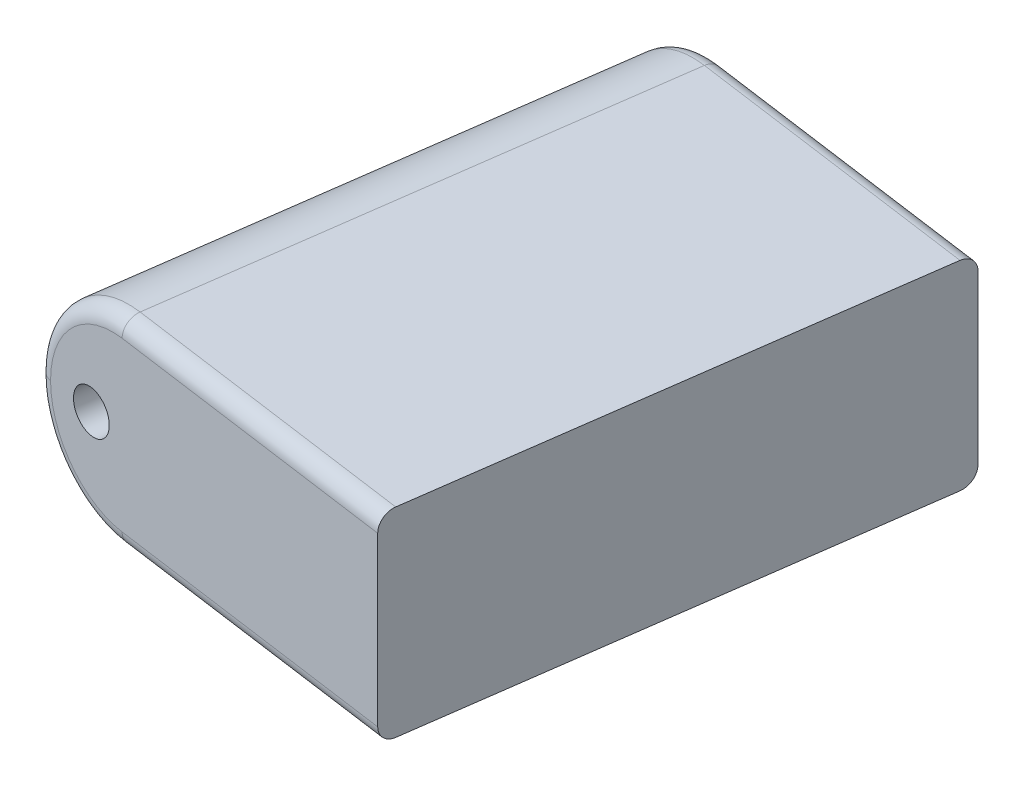
ISO-10303-21;
HEADER;
FILE_DESCRIPTION(('STEP AP214'),'2;1');
FILE_NAME('part.step','',(''),(''),'','','');
FILE_SCHEMA(('AUTOMOTIVE_DESIGN { 1 0 10303 214 1 1 1 1 }'));
ENDSEC;
DATA;
#1=APPLICATION_CONTEXT('core data for automotive mechanical design processes');
#2=APPLICATION_PROTOCOL_DEFINITION('international standard','automotive_design',2000,#1);
#3=PRODUCT_CONTEXT('',#1,'mechanical');
#4=PRODUCT('Part','Part','',(#3));
#5=PRODUCT_RELATED_PRODUCT_CATEGORY('part','',(#4));
#6=PRODUCT_DEFINITION_FORMATION('','',#4);
#7=PRODUCT_DEFINITION_CONTEXT('part definition',#1,'design');
#8=PRODUCT_DEFINITION('design','',#6,#7);
#9=PRODUCT_DEFINITION_SHAPE('','',#8);
#10=(LENGTH_UNIT() NAMED_UNIT(*) SI_UNIT(.MILLI.,.METRE.));
#11=(NAMED_UNIT(*) PLANE_ANGLE_UNIT() SI_UNIT($,.RADIAN.));
#12=(NAMED_UNIT(*) SI_UNIT($,.STERADIAN.) SOLID_ANGLE_UNIT());
#13=UNCERTAINTY_MEASURE_WITH_UNIT(LENGTH_MEASURE(1.E-05),#10,'distance_accuracy_value','');
#14=(GEOMETRIC_REPRESENTATION_CONTEXT(3) GLOBAL_UNCERTAINTY_ASSIGNED_CONTEXT((#13)) GLOBAL_UNIT_ASSIGNED_CONTEXT((#10,
#11,#12)) REPRESENTATION_CONTEXT('',''));
#15=CARTESIAN_POINT('',(0.,0.,0.));
#16=DIRECTION('',(0.,0.,1.));
#17=DIRECTION('',(1.,0.,0.));
#18=AXIS2_PLACEMENT_3D('',#15,#16,#17);
#19=CARTESIAN_POINT('',(-23.9416188893365,9.525,-6.04046528507022));
#20=DIRECTION('',(-0.990563834972414,0.,-0.137052139146913));
#21=DIRECTION('',(-0.137052139146913,0.,0.990563834972414));
#22=AXIS2_PLACEMENT_3D('',#19,#20,#21);
#23=PLANE('',#22);
#24=DIRECTION('',(0.137052139146913,0.,-0.990563834972414));
#25=VECTOR('',#24,1.);
#26=CARTESIAN_POINT('',(-23.9416188893365,0.,-6.04046528507022));
#27=LINE('',#26,#25);
#28=CARTESIAN_POINT('',(-27.3183094936381,0.,18.3650464809801));
#29=VERTEX_POINT('',#28);
#30=CARTESIAN_POINT('',(-24.0460526193664,0.,-5.28565564282124));
#31=VERTEX_POINT('',#30);
#32=EDGE_CURVE('E229',#29,#31,#27,.T.);
#33=ORIENTED_EDGE('',*,*,#32,.T.);
#34=CARTESIAN_POINT('',(-24.0460526193664,0.762000000000001,-5.28565564282124));
#35=DIRECTION('',(-0.990563834972414,0.,-0.137052139146913));
#36=DIRECTION('',(-0.137052139146913,0.,0.990563834972414));
#37=AXIS2_PLACEMENT_3D('',#34,#35,#36);
#38=CIRCLE('',#37,0.762);
#39=CARTESIAN_POINT('',(-23.9416188893365,0.762000000000004,-6.04046528507022));
#40=VERTEX_POINT('',#39);
#41=EDGE_CURVE('E148',#31,#40,#38,.F.);
#42=ORIENTED_EDGE('',*,*,#41,.T.);
#43=DIRECTION('',(0.,-1.,0.));
#44=VECTOR('',#43,1.);
#45=CARTESIAN_POINT('',(-23.9416188893365,9.525,-6.04046528507022));
#46=LINE('',#45,#44);
#47=CARTESIAN_POINT('',(-23.9416188893365,8.763,-6.04046528507022));
#48=VERTEX_POINT('',#47);
#49=EDGE_CURVE('E130',#48,#40,#46,.T.);
#50=ORIENTED_EDGE('',*,*,#49,.F.);
#51=CARTESIAN_POINT('',(-24.0460526193664,8.763,-5.28565564282124));
#52=DIRECTION('',(-0.990563834972414,0.,-0.137052139146913));
#53=DIRECTION('',(-0.137052139146913,0.,0.990563834972414));
#54=AXIS2_PLACEMENT_3D('',#51,#52,#53);
#55=CIRCLE('',#54,0.762);
#56=CARTESIAN_POINT('',(-24.0460526193664,9.525,-5.28565564282124));
#57=VERTEX_POINT('',#56);
#58=EDGE_CURVE('E145',#48,#57,#55,.F.);
#59=ORIENTED_EDGE('',*,*,#58,.T.);
#60=DIRECTION('',(0.137052139146913,0.,-0.990563834972414));
#61=VECTOR('',#60,1.);
#62=CARTESIAN_POINT('',(-23.9416188893365,9.525,-6.04046528507022));
#63=LINE('',#62,#61);
#64=CARTESIAN_POINT('',(-27.3183094936381,9.525,18.3650464809801));
#65=VERTEX_POINT('',#64);
#66=EDGE_CURVE('E225',#65,#57,#63,.T.);
#67=ORIENTED_EDGE('',*,*,#66,.F.);
#68=CARTESIAN_POINT('',(-27.3183094936381,8.763,18.3650464809801));
#69=DIRECTION('',(-0.990563834972414,0.,-0.137052139146913));
#70=DIRECTION('',(-0.137052139146913,0.,0.990563834972414));
#71=AXIS2_PLACEMENT_3D('',#68,#69,#70);
#72=CIRCLE('',#71,0.762);
#73=CARTESIAN_POINT('',(-27.4227432236681,8.763,19.1198561232291));
#74=VERTEX_POINT('',#73);
#75=EDGE_CURVE('E163',#65,#74,#72,.F.);
#76=ORIENTED_EDGE('',*,*,#75,.T.);
#77=DIRECTION('',(0.,-1.,0.));
#78=VECTOR('',#77,1.);
#79=CARTESIAN_POINT('',(-27.4227432236681,9.525,19.1198561232291));
#80=LINE('',#79,#78);
#81=CARTESIAN_POINT('',(-27.4227432236681,0.762000000000004,19.1198561232291));
#82=VERTEX_POINT('',#81);
#83=EDGE_CURVE('E151',#74,#82,#80,.T.);
#84=ORIENTED_EDGE('',*,*,#83,.T.);
#85=CARTESIAN_POINT('',(-27.3183094936381,0.762000000000001,18.3650464809801));
#86=DIRECTION('',(-0.990563834972414,0.,-0.137052139146913));
#87=DIRECTION('',(-0.137052139146913,0.,0.990563834972414));
#88=AXIS2_PLACEMENT_3D('',#85,#86,#87);
#89=CIRCLE('',#88,0.762);
#90=EDGE_CURVE('E157',#82,#29,#89,.F.);
#91=ORIENTED_EDGE('',*,*,#90,.T.);
#92=EDGE_LOOP('',(#33,#42,#50,#59,#67,#76,#84,#91));
#93=FACE_BOUND('',#92,.T.);
#94=ADVANCED_FACE('F45',(#93),#23,.F.);
#95=CARTESIAN_POINT('',(-42.8118599455609,9.525,-8.65130853581891));
#96=DIRECTION('',(-0.137052139146913,0.,0.990563834972414));
#97=DIRECTION('',(0.990563834972414,0.,0.137052139146913));
#98=AXIS2_PLACEMENT_3D('',#95,#96,#97);
#99=PLANE('',#98);
#100=ORIENTED_EDGE('',*,*,#49,.T.);
#101=DIRECTION('',(-0.990563834972414,0.,-0.137052139146913));
#102=VECTOR('',#101,1.);
#103=CARTESIAN_POINT('',(-38.0942996815048,0.762000000000001,-7.99859772313174));
#104=LINE('',#103,#102);
#105=CARTESIAN_POINT('',(-38.0942996815048,0.762,-7.99859772313174));
#106=VERTEX_POINT('',#105);
#107=EDGE_CURVE('E139',#40,#106,#104,.T.);
#108=ORIENTED_EDGE('',*,*,#107,.T.);
#109=CARTESIAN_POINT('',(-38.0942996815048,4.7625,-7.99859772313174));
#110=DIRECTION('',(-0.137052139146913,0.,0.990563834972414));
#111=DIRECTION('',(0.990563834972414,0.,0.137052139146913));
#112=AXIS2_PLACEMENT_3D('',#109,#110,#111);
#113=CIRCLE('',#112,4.0005);
#114=CARTESIAN_POINT('',(-42.057050303312,4.7625,-8.54687480578897));
#115=VERTEX_POINT('',#114);
#116=EDGE_CURVE('E140',#106,#115,#113,.F.);
#117=ORIENTED_EDGE('',*,*,#116,.T.);
#118=CARTESIAN_POINT('',(-38.0942996815048,4.7625,-7.99859772313174));
#119=DIRECTION('',(-0.137052139146913,0.,0.990563834972414));
#120=DIRECTION('',(0.990563834972414,0.,0.137052139146913));
#121=AXIS2_PLACEMENT_3D('',#118,#119,#120);
#122=CIRCLE('',#121,4.0005);
#123=CARTESIAN_POINT('',(-38.0942996815048,8.763,-7.99859772313174));
#124=VERTEX_POINT('',#123);
#125=EDGE_CURVE('E133',#115,#124,#122,.F.);
#126=ORIENTED_EDGE('',*,*,#125,.T.);
#127=DIRECTION('',(-0.990563834972414,0.,-0.137052139146913));
#128=VECTOR('',#127,1.);
#129=CARTESIAN_POINT('',(-42.8118599455609,8.763,-8.65130853581891));
#130=LINE('',#129,#128);
#131=EDGE_CURVE('E125',#124,#48,#130,.F.);
#132=ORIENTED_EDGE('',*,*,#131,.T.);
#133=EDGE_LOOP('',(#100,#108,#117,#126,#132));
#134=FACE_BOUND('',#133,.T.);
#135=CARTESIAN_POINT('',(-39.7967519465306,4.7625,-8.23414511188111));
#136=DIRECTION('',(0.137052139146914,0.,-0.990563834972414));
#137=DIRECTION('',(-0.990563834972414,0.,-0.137052139146914));
#138=AXIS2_PLACEMENT_3D('',#135,#136,#137);
#139=CIRCLE('',#138,2.);
#140=CARTESIAN_POINT('',(-41.7778796164755,4.7625,-8.50824939017494));
#141=VERTEX_POINT('',#140);
#142=EDGE_CURVE('E237',#141,#141,#139,.T.);
#143=ORIENTED_EDGE('',*,*,#142,.F.);
#144=EDGE_LOOP('',(#143));
#145=FACE_BOUND('',#144,.T.);
#146=ADVANCED_FACE('F127',(#134,#145),#99,.F.);
#147=CARTESIAN_POINT('',(-27.4227432236681,9.525,19.1198561232291));
#148=DIRECTION('',(0.137052139146913,0.,-0.990563834972414));
#149=DIRECTION('',(-0.990563834972414,0.,-0.137052139146913));
#150=AXIS2_PLACEMENT_3D('',#147,#148,#149);
#151=PLANE('',#150);
#152=CARTESIAN_POINT('',(-43.2778762808622,4.7625,16.9261762964182));
#153=DIRECTION('',(0.137052139146913,0.,-0.990563834972414));
#154=DIRECTION('',(-0.990563834972414,0.,-0.137052139146913));
#155=AXIS2_PLACEMENT_3D('',#152,#153,#154);
#156=CIRCLE('',#155,1.);
#157=CARTESIAN_POINT('',(-44.2684401158347,4.7625,16.7891241572713));
#158=VERTEX_POINT('',#157);
#159=EDGE_CURVE('E240',#158,#158,#156,.T.);
#160=ORIENTED_EDGE('',*,*,#159,.T.);
#161=EDGE_LOOP('',(#160));
#162=FACE_BOUND('',#161,.T.);
#163=CARTESIAN_POINT('',(-41.5754240158364,4.7625,17.1617236851676));
#164=DIRECTION('',(0.137052139146913,0.,-0.990563834972414));
#165=DIRECTION('',(-0.990563834972414,0.,-0.137052139146913));
#166=AXIS2_PLACEMENT_3D('',#163,#164,#165);
#167=CIRCLE('',#166,4.0005);
#168=CARTESIAN_POINT('',(-45.5381746376436,4.7625,16.6134466025103));
#169=VERTEX_POINT('',#168);
#170=CARTESIAN_POINT('',(-41.5754240158364,0.762,17.1617236851676));
#171=VERTEX_POINT('',#170);
#172=EDGE_CURVE('E177',#169,#171,#167,.F.);
#173=ORIENTED_EDGE('',*,*,#172,.T.);
#174=DIRECTION('',(0.990563834972414,0.,0.137052139146913));
#175=VECTOR('',#174,1.);
#176=CARTESIAN_POINT('',(-27.4227432236681,0.762000000000001,19.1198561232291));
#177=LINE('',#176,#175);
#178=EDGE_CURVE('E180',#171,#82,#177,.T.);
#179=ORIENTED_EDGE('',*,*,#178,.T.);
#180=ORIENTED_EDGE('',*,*,#83,.F.);
#181=DIRECTION('',(0.990563834972414,0.,0.137052139146913));
#182=VECTOR('',#181,1.);
#183=CARTESIAN_POINT('',(-27.4227432236681,8.763,19.1198561232291));
#184=LINE('',#183,#182);
#185=CARTESIAN_POINT('',(-41.5754240158364,8.763,17.1617236851676));
#186=VERTEX_POINT('',#185);
#187=EDGE_CURVE('E171',#74,#186,#184,.F.);
#188=ORIENTED_EDGE('',*,*,#187,.T.);
#189=CARTESIAN_POINT('',(-41.5754240158364,4.7625,17.1617236851676));
#190=DIRECTION('',(0.137052139146913,0.,-0.990563834972414));
#191=DIRECTION('',(-0.990563834972414,0.,-0.137052139146913));
#192=AXIS2_PLACEMENT_3D('',#189,#190,#191);
#193=CIRCLE('',#192,4.0005);
#194=EDGE_CURVE('E174',#186,#169,#193,.F.);
#195=ORIENTED_EDGE('',*,*,#194,.T.);
#196=EDGE_LOOP('',(#173,#179,#180,#188,#195));
#197=FACE_BOUND('',#196,.T.);
#198=ADVANCED_FACE('F297',(#162,#197),#151,.F.);
#199=CARTESIAN_POINT('',(0.,9.525,0.));
#200=DIRECTION('',(0.,-1.,0.));
#201=DIRECTION('',(0.,0.,-1.));
#202=AXIS2_PLACEMENT_3D('',#199,#200,#201);
#203=PLANE('',#202);
#204=ORIENTED_EDGE('',*,*,#66,.T.);
#205=DIRECTION('',(-0.990563834972414,0.,-0.137052139146913));
#206=VECTOR('',#205,1.);
#207=CARTESIAN_POINT('',(0.265910804515712,9.525,-1.92190817247537));
#208=LINE('',#207,#206);
#209=CARTESIAN_POINT('',(-38.1987334115348,9.525,-7.24378808088276));
#210=VERTEX_POINT('',#209);
#211=EDGE_CURVE('E155',#57,#210,#208,.T.);
#212=ORIENTED_EDGE('',*,*,#211,.T.);
#213=DIRECTION('',(-0.137052139146913,0.,0.990563834972414));
#214=VECTOR('',#213,1.);
#215=CARTESIAN_POINT('',(-38.4646442160505,9.525,-5.3218799084074));
#216=LINE('',#215,#214);
#217=CARTESIAN_POINT('',(-41.4709902858065,9.525,16.4069140429186));
#218=VERTEX_POINT('',#217);
#219=EDGE_CURVE('E150',#210,#218,#216,.T.);
#220=ORIENTED_EDGE('',*,*,#219,.T.);
#221=DIRECTION('',(0.990563834972414,0.,0.137052139146913));
#222=VECTOR('',#221,1.);
#223=CARTESIAN_POINT('',(-3.00634606975599,9.525,21.728793951326));
#224=LINE('',#223,#222);
#225=EDGE_CURVE('E161',#218,#65,#224,.T.);
#226=ORIENTED_EDGE('',*,*,#225,.T.);
#227=EDGE_LOOP('',(#204,#212,#220,#226));
#228=FACE_BOUND('',#227,.T.);
#229=ADVANCED_FACE('F224',(#228),#203,.F.);
#230=CARTESIAN_POINT('',(0.,0.,0.));
#231=DIRECTION('',(0.,-1.,0.));
#232=DIRECTION('',(0.,0.,-1.));
#233=AXIS2_PLACEMENT_3D('',#230,#231,#232);
#234=PLANE('',#233);
#235=DIRECTION('',(-0.137052139146913,0.,0.990563834972414));
#236=VECTOR('',#235,1.);
#237=CARTESIAN_POINT('',(-38.0942996815048,0.,-7.99859772313174));
#238=LINE('',#237,#236);
#239=CARTESIAN_POINT('',(-41.4709902858065,0.,16.4069140429186));
#240=VERTEX_POINT('',#239);
#241=CARTESIAN_POINT('',(-38.1987334115348,0.,-7.24378808088276));
#242=VERTEX_POINT('',#241);
#243=EDGE_CURVE('E247',#240,#242,#238,.F.);
#244=ORIENTED_EDGE('',*,*,#243,.T.);
#245=DIRECTION('',(-0.990563834972414,0.,-0.137052139146913));
#246=VECTOR('',#245,1.);
#247=CARTESIAN_POINT('',(-24.0460526193664,0.,-5.28565564282124));
#248=LINE('',#247,#246);
#249=EDGE_CURVE('E262',#242,#31,#248,.F.);
#250=ORIENTED_EDGE('',*,*,#249,.T.);
#251=ORIENTED_EDGE('',*,*,#32,.F.);
#252=DIRECTION('',(0.990563834972414,0.,0.137052139146913));
#253=VECTOR('',#252,1.);
#254=CARTESIAN_POINT('',(-41.4709902858065,0.,16.4069140429186));
#255=LINE('',#254,#253);
#256=EDGE_CURVE('E259',#29,#240,#255,.F.);
#257=ORIENTED_EDGE('',*,*,#256,.T.);
#258=EDGE_LOOP('',(#244,#250,#251,#257));
#259=FACE_BOUND('',#258,.T.);
#260=ADVANCED_FACE('F268',(#259),#234,.T.);
#261=CARTESIAN_POINT('',(-40.1667927222273,4.7625,-5.5596227574556));
#262=DIRECTION('',(0.137052139146914,0.,-0.990563834972413));
#263=DIRECTION('',(-0.990563834972414,0.,-0.137052139146914));
#264=AXIS2_PLACEMENT_3D('',#261,#262,#263);
#265=CYLINDRICAL_SURFACE('',#264,2.);
#266=CARTESIAN_POINT('',(-40.1667927222273,4.7625,-5.5596227574556));
#267=DIRECTION('',(0.137052139146914,0.,-0.990563834972414));
#268=DIRECTION('',(-0.990563834972414,0.,-0.137052139146914));
#269=AXIS2_PLACEMENT_3D('',#266,#267,#268);
#270=CIRCLE('',#269,2.);
#271=CARTESIAN_POINT('',(-42.1479203921721,4.7625,-5.83372703574942));
#272=VERTEX_POINT('',#271);
#273=EDGE_CURVE('E234',#272,#272,#270,.T.);
#274=CARTESIAN_POINT('',(-42.1479203921721,4.7625,-5.83372703574942));
#275=CARTESIAN_POINT('',(-42.1440658007586,4.7625,-5.86158664360802));
#276=CARTESIAN_POINT('',(-42.1402112093451,4.7625,-5.88944625146662));
#277=CARTESIAN_POINT('',(-42.1325020265181,4.7625,-5.94516546718382));
#278=CARTESIAN_POINT('',(-42.1286474351046,4.7625,-5.97302507504242));
#279=CARTESIAN_POINT('',(-42.1209382522776,4.7625,-6.02874429075962));
#280=CARTESIAN_POINT('',(-42.1170836608641,4.7625,-6.05660389861822));
#281=CARTESIAN_POINT('',(-42.1093744780371,4.7625,-6.11232311433541));
#282=CARTESIAN_POINT('',(-42.1055198866236,4.7625,-6.14018272219401));
#283=CARTESIAN_POINT('',(-42.0978107037965,4.7625,-6.19590193791121));
#284=CARTESIAN_POINT('',(-42.093956112383,4.7625,-6.22376154576981));
#285=CARTESIAN_POINT('',(-42.086246929556,4.7625,-6.27948076148701));
#286=CARTESIAN_POINT('',(-42.0823923381425,4.7625,-6.30734036934561));
#287=CARTESIAN_POINT('',(-42.0746831553155,4.7625,-6.36305958506281));
#288=CARTESIAN_POINT('',(-42.070828563902,4.7625,-6.3909191929214));
#289=CARTESIAN_POINT('',(-42.063119381075,4.7625,-6.4466384086386));
#290=CARTESIAN_POINT('',(-42.0592647896615,4.7625,-6.4744980164972));
#291=CARTESIAN_POINT('',(-42.0515556068345,4.7625,-6.5302172322144));
#292=CARTESIAN_POINT('',(-42.0477010154209,4.7625,-6.558076840073));
#293=CARTESIAN_POINT('',(-42.0399918325939,4.7625,-6.6137960557902));
#294=CARTESIAN_POINT('',(-42.0361372411804,4.7625,-6.6416556636488));
#295=CARTESIAN_POINT('',(-42.0284280583534,4.7625,-6.697374879366));
#296=CARTESIAN_POINT('',(-42.0245734669399,4.7625,-6.7252344872246));
#297=CARTESIAN_POINT('',(-42.0168642841129,4.7625,-6.78095370294179));
#298=CARTESIAN_POINT('',(-42.0130096926994,4.7625,-6.80881331080039));
#299=CARTESIAN_POINT('',(-42.0053005098724,4.7625,-6.86453252651759));
#300=CARTESIAN_POINT('',(-42.0014459184589,4.7625,-6.89239213437619));
#301=CARTESIAN_POINT('',(-41.9937367356319,4.7625,-6.94811135009339));
#302=CARTESIAN_POINT('',(-41.9898821442183,4.7625,-6.97597095795199));
#303=CARTESIAN_POINT('',(-41.9821729613913,4.7625,-7.03169017366919));
#304=CARTESIAN_POINT('',(-41.9783183699778,4.7625,-7.05954978152778));
#305=CARTESIAN_POINT('',(-41.9706091871508,4.7625,-7.11526899724498));
#306=CARTESIAN_POINT('',(-41.9667545957373,4.7625,-7.14312860510358));
#307=CARTESIAN_POINT('',(-41.9590454129103,4.7625,-7.19884782082078));
#308=CARTESIAN_POINT('',(-41.9551908214968,4.7625,-7.22670742867938));
#309=CARTESIAN_POINT('',(-41.9474816386698,4.7625,-7.28242664439658));
#310=CARTESIAN_POINT('',(-41.9436270472563,4.7625,-7.31028625225518));
#311=CARTESIAN_POINT('',(-41.9359178644293,4.7625,-7.36600546797237));
#312=CARTESIAN_POINT('',(-41.9320632730157,4.7625,-7.39386507583097));
#313=CARTESIAN_POINT('',(-41.9243540901887,4.7625,-7.44958429154817));
#314=CARTESIAN_POINT('',(-41.9204994987752,4.7625,-7.47744389940677));
#315=CARTESIAN_POINT('',(-41.9127903159482,4.7625,-7.53316311512397));
#316=CARTESIAN_POINT('',(-41.9089357245347,4.7625,-7.56102272298257));
#317=CARTESIAN_POINT('',(-41.9012265417077,4.7625,-7.61674193869977));
#318=CARTESIAN_POINT('',(-41.8973719502942,4.7625,-7.64460154655837));
#319=CARTESIAN_POINT('',(-41.8896627674672,4.7625,-7.70032076227556));
#320=CARTESIAN_POINT('',(-41.8858081760537,4.7625,-7.72818037013416));
#321=CARTESIAN_POINT('',(-41.8780989932267,4.7625,-7.78389958585136));
#322=CARTESIAN_POINT('',(-41.8742444018131,4.7625,-7.81175919370996));
#323=CARTESIAN_POINT('',(-41.8665352189861,4.7625,-7.86747840942716));
#324=CARTESIAN_POINT('',(-41.8626806275726,4.7625,-7.89533801728576));
#325=CARTESIAN_POINT('',(-41.8549714447456,4.7625,-7.95105723300296));
#326=CARTESIAN_POINT('',(-41.8511168533321,4.7625,-7.97891684086156));
#327=CARTESIAN_POINT('',(-41.8434076705051,4.7625,-8.03463605657875));
#328=CARTESIAN_POINT('',(-41.8395530790916,4.7625,-8.06249566443735));
#329=CARTESIAN_POINT('',(-41.8318438962646,4.7625,-8.11821488015455));
#330=CARTESIAN_POINT('',(-41.8279893048511,4.7625,-8.14607448801315));
#331=CARTESIAN_POINT('',(-41.820280122024,4.7625,-8.20179370373035));
#332=CARTESIAN_POINT('',(-41.8164255306105,4.7625,-8.22965331158895));
#333=CARTESIAN_POINT('',(-41.8087163477835,4.7625,-8.28537252730615));
#334=CARTESIAN_POINT('',(-41.80486175637,4.7625,-8.31323213516475));
#335=CARTESIAN_POINT('',(-41.797152573543,4.7625,-8.36895135088194));
#336=CARTESIAN_POINT('',(-41.7932979821295,4.7625,-8.39681095874054));
#337=CARTESIAN_POINT('',(-41.7855887993025,4.7625,-8.45253017445774));
#338=CARTESIAN_POINT('',(-41.781734207889,4.7625,-8.48038978231634));
#339=CARTESIAN_POINT('',(-41.7778796164755,4.7625,-8.50824939017494));
#340=B_SPLINE_CURVE_WITH_KNOTS('',3,(#274,#275,#276,#277,#278,#279,#280,#281,#282,#283,#284,
#285,#286,#287,#288,#289,#290,#291,#292,#293,#294,#295,#296,#297,#298,#299,#300,#301,#302,#303,
#304,#305,#306,#307,#308,#309,#310,#311,#312,#313,#314,#315,#316,#317,#318,#319,#320,#321,#322,
#323,#324,#325,#326,#327,#328,#329,#330,#331,#332,#333,#334,#335,#336,#337,#338,#339),
.UNSPECIFIED.,.F.,.F.,(4,2,2,2,2,2,2,2,2,2,2,2,2,2,2,2,2,2,2,2,2,2,2,2,2,2,2,2,2,2,2,2,4),(0.,
0.084375,0.168750000000001,0.253125,0.337500000000001,0.421875,0.50625,0.590625,0.675,0.759375,
0.843750000000001,0.928125000000001,1.0125,1.096875,1.18125,1.265625,1.35,1.434375,1.51875,
1.603125,1.6875,1.771875,1.85625,1.940625,2.025,2.109375,2.19375,2.278125,2.3625,2.446875,
2.53125,2.615625,2.7),.UNSPECIFIED.);
#341=EDGE_CURVE('BSEAM305',#272,#141,#340,.T.);
#342=ORIENTED_EDGE('',*,*,#273,.F.);
#343=ORIENTED_EDGE('',*,*,#142,.T.);
#344=ORIENTED_EDGE('',*,*,#341,.T.);
#345=ORIENTED_EDGE('',*,*,#341,.F.);
#346=EDGE_LOOP('',(#342,#344,#343,#345));
#347=FACE_BOUND('',#346,.T.);
#348=ADVANCED_FACE('F305',(#347),#265,.F.);
#349=CARTESIAN_POINT('',(-40.1667927222273,4.7625,-5.5596227574556));
#350=DIRECTION('',(0.137052139146914,0.,-0.990563834972414));
#351=DIRECTION('',(-0.990563834972414,0.,-0.137052139146914));
#352=AXIS2_PLACEMENT_3D('',#349,#350,#351);
#353=PLANE('',#352);
#354=CARTESIAN_POINT('',(-40.1667927222273,4.7625,-5.55962275745559));
#355=DIRECTION('',(0.137052139146914,0.,-0.990563834972414));
#356=DIRECTION('',(-0.990563834972414,0.,-0.137052139146914));
#357=AXIS2_PLACEMENT_3D('',#354,#355,#356);
#358=CIRCLE('',#357,1.);
#359=CARTESIAN_POINT('',(-41.1573565571997,4.7625,-5.69667489660251));
#360=VERTEX_POINT('',#359);
#361=EDGE_CURVE('E244',#360,#360,#358,.T.);
#362=ORIENTED_EDGE('',*,*,#361,.F.);
#363=EDGE_LOOP('',(#362));
#364=FACE_BOUND('',#363,.T.);
#365=ORIENTED_EDGE('',*,*,#273,.T.);
#366=EDGE_LOOP('',(#365));
#367=FACE_BOUND('',#366,.T.);
#368=ADVANCED_FACE('F310',(#364,#367),#353,.T.);
#369=CARTESIAN_POINT('',(-43.6323214691913,4.7625,19.4879793242597));
#370=DIRECTION('',(0.137052139146914,0.,-0.990563834972414));
#371=DIRECTION('',(-0.990563834972414,0.,-0.137052139146914));
#372=AXIS2_PLACEMENT_3D('',#369,#370,#371);
#373=CYLINDRICAL_SURFACE('',#372,1.);
#374=ORIENTED_EDGE('',*,*,#361,.T.);
#375=EDGE_LOOP('',(#374));
#376=FACE_BOUND('',#375,.T.);
#377=ORIENTED_EDGE('',*,*,#159,.F.);
#378=EDGE_LOOP('',(#377));
#379=FACE_BOUND('',#378,.T.);
#380=ADVANCED_FACE('F289',(#376,#379),#373,.F.);
#381=CARTESIAN_POINT('',(-38.0942996815048,4.7625,-7.99859772313174));
#382=DIRECTION('',(0.137052139146913,0.,-0.990563834972414));
#383=DIRECTION('',(-0.990563834972414,0.,-0.137052139146913));
#384=AXIS2_PLACEMENT_3D('',#381,#382,#383);
#385=CYLINDRICAL_SURFACE('',#384,4.7625);
#386=ORIENTED_EDGE('',*,*,#243,.F.);
#387=CARTESIAN_POINT('',(-41.4709902858065,4.7625,16.4069140429186));
#388=DIRECTION('',(0.137052139146913,0.,-0.990563834972414));
#389=DIRECTION('',(-0.990563834972414,0.,-0.137052139146913));
#390=AXIS2_PLACEMENT_3D('',#387,#388,#389);
#391=CIRCLE('',#390,4.7625);
#392=CARTESIAN_POINT('',(-46.1885505498626,4.7625,15.7542032302314));
#393=VERTEX_POINT('',#392);
#394=EDGE_CURVE('E63',#240,#393,#391,.T.);
#395=ORIENTED_EDGE('',*,*,#394,.T.);
#396=DIRECTION('',(-0.137052139146913,0.,0.990563834972414));
#397=VECTOR('',#396,1.);
#398=CARTESIAN_POINT('',(-46.2929842798926,4.7625,16.5090128724804));
#399=LINE('',#398,#397);
#400=CARTESIAN_POINT('',(-42.9162936755909,4.7625,-7.89649889356994));
#401=VERTEX_POINT('',#400);
#402=EDGE_CURVE('E201',#401,#393,#399,.T.);
#403=ORIENTED_EDGE('',*,*,#402,.F.);
#404=CARTESIAN_POINT('',(-38.1987334115348,4.7625,-7.24378808088276));
#405=DIRECTION('',(-0.137052139146913,0.,0.990563834972414));
#406=DIRECTION('',(0.990563834972414,0.,0.137052139146913));
#407=AXIS2_PLACEMENT_3D('',#404,#405,#406);
#408=CIRCLE('',#407,4.7625);
#409=EDGE_CURVE('E184',#401,#242,#408,.T.);
#410=ORIENTED_EDGE('',*,*,#409,.T.);
#411=EDGE_LOOP('',(#386,#395,#403,#410));
#412=FACE_BOUND('',#411,.T.);
#413=ADVANCED_FACE('F280',(#412),#385,.T.);
#414=CARTESIAN_POINT('',(-38.4646442160505,4.7625,-5.3218799084074));
#415=DIRECTION('',(-0.137052139146913,0.,0.990563834972414));
#416=DIRECTION('',(0.990563834972414,0.,0.137052139146913));
#417=AXIS2_PLACEMENT_3D('',#414,#415,#416);
#418=CYLINDRICAL_SURFACE('',#417,4.7625);
#419=ORIENTED_EDGE('',*,*,#402,.T.);
#420=CARTESIAN_POINT('',(-41.4709902858065,4.7625,16.4069140429186));
#421=DIRECTION('',(0.137052139146913,0.,-0.990563834972414));
#422=DIRECTION('',(-0.990563834972414,0.,-0.137052139146913));
#423=AXIS2_PLACEMENT_3D('',#420,#421,#422);
#424=CIRCLE('',#423,4.7625);
#425=EDGE_CURVE('E11',#393,#218,#424,.T.);
#426=ORIENTED_EDGE('',*,*,#425,.T.);
#427=ORIENTED_EDGE('',*,*,#219,.F.);
#428=CARTESIAN_POINT('',(-38.1987334115348,4.7625,-7.24378808088276));
#429=DIRECTION('',(-0.137052139146913,0.,0.990563834972414));
#430=DIRECTION('',(0.990563834972414,0.,0.137052139146913));
#431=AXIS2_PLACEMENT_3D('',#428,#429,#430);
#432=CIRCLE('',#431,4.7625);
#433=EDGE_CURVE('E55',#210,#401,#432,.T.);
#434=ORIENTED_EDGE('',*,*,#433,.T.);
#435=EDGE_LOOP('',(#419,#426,#427,#434));
#436=FACE_BOUND('',#435,.T.);
#437=ADVANCED_FACE('F281',(#436),#418,.T.);
#438=CARTESIAN_POINT('',(0.265910804515713,8.763,-1.92190817247537));
#439=DIRECTION('',(-0.990563834972414,0.,-0.137052139146913));
#440=DIRECTION('',(-0.137052139146913,0.,0.990563834972414));
#441=AXIS2_PLACEMENT_3D('',#438,#439,#440);
#442=CYLINDRICAL_SURFACE('',#441,0.762);
#443=ORIENTED_EDGE('',*,*,#58,.F.);
#444=ORIENTED_EDGE('',*,*,#131,.F.);
#445=CARTESIAN_POINT('',(-38.1987334115348,8.763,-7.24378808088276));
#446=DIRECTION('',(-0.990563834972414,0.,-0.137052139146913));
#447=DIRECTION('',(-0.137052139146913,0.,0.990563834972414));
#448=AXIS2_PLACEMENT_3D('',#445,#446,#447);
#449=CIRCLE('',#448,0.762);
#450=EDGE_CURVE('E198',#210,#124,#449,.T.);
#451=ORIENTED_EDGE('',*,*,#450,.F.);
#452=ORIENTED_EDGE('',*,*,#211,.F.);
#453=EDGE_LOOP('',(#443,#444,#451,#452));
#454=FACE_BOUND('',#453,.T.);
#455=ADVANCED_FACE('F154',(#454),#442,.T.);
#456=CARTESIAN_POINT('',(-38.1987334115348,4.7625,-7.24378808088276));
#457=DIRECTION('',(-0.137052139146913,0.,0.990563834972414));
#458=DIRECTION('',(0.990563834972414,0.,0.137052139146913));
#459=AXIS2_PLACEMENT_3D('',#456,#457,#458);
#460=TOROIDAL_SURFACE('',#459,4.0005,0.762);
#461=ORIENTED_EDGE('',*,*,#450,.T.);
#462=ORIENTED_EDGE('',*,*,#125,.F.);
#463=CARTESIAN_POINT('',(-42.1614840333419,4.7625,-7.79206516353999));
#464=DIRECTION('',(0.,-1.,0.));
#465=DIRECTION('',(0.,0.,-1.));
#466=AXIS2_PLACEMENT_3D('',#463,#464,#465);
#467=CIRCLE('',#466,0.762);
#468=EDGE_CURVE('E194',#401,#115,#467,.T.);
#469=ORIENTED_EDGE('',*,*,#468,.F.);
#470=ORIENTED_EDGE('',*,*,#433,.F.);
#471=EDGE_LOOP('',(#461,#462,#469,#470));
#472=FACE_BOUND('',#471,.T.);
#473=ADVANCED_FACE('F277',(#472),#460,.T.);
#474=CARTESIAN_POINT('',(-38.1987334115348,4.7625,-7.24378808088276));
#475=DIRECTION('',(-0.137052139146913,0.,0.990563834972414));
#476=DIRECTION('',(0.990563834972414,0.,0.137052139146913));
#477=AXIS2_PLACEMENT_3D('',#474,#475,#476);
#478=TOROIDAL_SURFACE('',#477,4.0005,0.762);
#479=ORIENTED_EDGE('',*,*,#468,.T.);
#480=ORIENTED_EDGE('',*,*,#116,.F.);
#481=CARTESIAN_POINT('',(-38.1987334115348,0.762,-7.24378808088276));
#482=DIRECTION('',(0.990563834972414,0.,0.137052139146913));
#483=DIRECTION('',(0.137052139146913,0.,-0.990563834972414));
#484=AXIS2_PLACEMENT_3D('',#481,#482,#483);
#485=CIRCLE('',#484,0.762);
#486=EDGE_CURVE('E191',#242,#106,#485,.T.);
#487=ORIENTED_EDGE('',*,*,#486,.F.);
#488=ORIENTED_EDGE('',*,*,#409,.F.);
#489=EDGE_LOOP('',(#479,#480,#487,#488));
#490=FACE_BOUND('',#489,.T.);
#491=ADVANCED_FACE('F279',(#490),#478,.T.);
#492=CARTESIAN_POINT('',(-42.9162936755909,0.762000000000001,-7.89649889356993));
#493=DIRECTION('',(0.990563834972414,0.,0.137052139146913));
#494=DIRECTION('',(0.137052139146913,0.,-0.990563834972414));
#495=AXIS2_PLACEMENT_3D('',#492,#493,#494);
#496=CYLINDRICAL_SURFACE('',#495,0.762);
#497=ORIENTED_EDGE('',*,*,#41,.F.);
#498=ORIENTED_EDGE('',*,*,#249,.F.);
#499=ORIENTED_EDGE('',*,*,#486,.T.);
#500=ORIENTED_EDGE('',*,*,#107,.F.);
#501=EDGE_LOOP('',(#497,#498,#499,#500));
#502=FACE_BOUND('',#501,.T.);
#503=ADVANCED_FACE('F272',(#502),#496,.T.);
#504=CARTESIAN_POINT('',(-3.00634606975599,8.763,21.728793951326));
#505=DIRECTION('',(0.990563834972414,0.,0.137052139146913));
#506=DIRECTION('',(0.137052139146913,0.,-0.990563834972414));
#507=AXIS2_PLACEMENT_3D('',#504,#505,#506);
#508=CYLINDRICAL_SURFACE('',#507,0.762);
#509=ORIENTED_EDGE('',*,*,#75,.F.);
#510=ORIENTED_EDGE('',*,*,#225,.F.);
#511=CARTESIAN_POINT('',(-41.4709902858065,8.763,16.4069140429186));
#512=DIRECTION('',(-0.990563834972414,0.,-0.137052139146913));
#513=DIRECTION('',(-0.137052139146913,0.,0.990563834972414));
#514=AXIS2_PLACEMENT_3D('',#511,#512,#513);
#515=CIRCLE('',#514,0.762);
#516=EDGE_CURVE('E49',#186,#218,#515,.T.);
#517=ORIENTED_EDGE('',*,*,#516,.F.);
#518=ORIENTED_EDGE('',*,*,#187,.F.);
#519=EDGE_LOOP('',(#509,#510,#517,#518));
#520=FACE_BOUND('',#519,.T.);
#521=ADVANCED_FACE('F47',(#520),#508,.T.);
#522=CARTESIAN_POINT('',(-41.4709902858065,4.7625,16.4069140429186));
#523=DIRECTION('',(0.137052139146913,0.,-0.990563834972414));
#524=DIRECTION('',(-0.990563834972414,0.,-0.137052139146913));
#525=AXIS2_PLACEMENT_3D('',#522,#523,#524);
#526=TOROIDAL_SURFACE('',#525,4.0005,0.762);
#527=ORIENTED_EDGE('',*,*,#516,.T.);
#528=ORIENTED_EDGE('',*,*,#425,.F.);
#529=CARTESIAN_POINT('',(-45.4337409076136,4.7625,15.8586369602614));
#530=DIRECTION('',(0.,-1.,0.));
#531=DIRECTION('',(0.,0.,-1.));
#532=AXIS2_PLACEMENT_3D('',#529,#530,#531);
#533=CIRCLE('',#532,0.762);
#534=EDGE_CURVE('E205',#169,#393,#533,.T.);
#535=ORIENTED_EDGE('',*,*,#534,.F.);
#536=ORIENTED_EDGE('',*,*,#194,.F.);
#537=EDGE_LOOP('',(#527,#528,#535,#536));
#538=FACE_BOUND('',#537,.T.);
#539=ADVANCED_FACE('F217',(#538),#526,.T.);
#540=CARTESIAN_POINT('',(-41.4709902858065,4.7625,16.4069140429186));
#541=DIRECTION('',(0.137052139146913,0.,-0.990563834972414));
#542=DIRECTION('',(-0.990563834972414,0.,-0.137052139146913));
#543=AXIS2_PLACEMENT_3D('',#540,#541,#542);
#544=TOROIDAL_SURFACE('',#543,4.0005,0.762);
#545=ORIENTED_EDGE('',*,*,#534,.T.);
#546=ORIENTED_EDGE('',*,*,#394,.F.);
#547=CARTESIAN_POINT('',(-41.4709902858065,0.762,16.4069140429186));
#548=DIRECTION('',(0.990563834972414,0.,0.137052139146912));
#549=DIRECTION('',(0.137052139146912,0.,-0.990563834972414));
#550=AXIS2_PLACEMENT_3D('',#547,#548,#549);
#551=CIRCLE('',#550,0.762);
#552=EDGE_CURVE('E202',#171,#240,#551,.T.);
#553=ORIENTED_EDGE('',*,*,#552,.F.);
#554=ORIENTED_EDGE('',*,*,#172,.F.);
#555=EDGE_LOOP('',(#545,#546,#553,#554));
#556=FACE_BOUND('',#555,.T.);
#557=ADVANCED_FACE('F325',(#556),#544,.T.);
#558=CARTESIAN_POINT('',(-27.3183094936381,0.762000000000001,18.3650464809801));
#559=DIRECTION('',(-0.990563834972414,0.,-0.137052139146913));
#560=DIRECTION('',(-0.137052139146913,0.,0.990563834972414));
#561=AXIS2_PLACEMENT_3D('',#558,#559,#560);
#562=CYLINDRICAL_SURFACE('',#561,0.762);
#563=ORIENTED_EDGE('',*,*,#552,.T.);
#564=ORIENTED_EDGE('',*,*,#256,.F.);
#565=ORIENTED_EDGE('',*,*,#90,.F.);
#566=ORIENTED_EDGE('',*,*,#178,.F.);
#567=EDGE_LOOP('',(#563,#564,#565,#566));
#568=FACE_BOUND('',#567,.T.);
#569=ADVANCED_FACE('F327',(#568),#562,.T.);
#570=CLOSED_SHELL('',(#94,#146,#198,#229,#260,#348,#368,#380,#413,#437,#455,#473,#491,#503,#521,
#539,#557,#569));
#571=MANIFOLD_SOLID_BREP('B2',#570);
#572=ADVANCED_BREP_SHAPE_REPRESENTATION('',(#18,#571),#14);
#573=SHAPE_DEFINITION_REPRESENTATION(#9,#572);
ENDSEC;
END-ISO-10303-21;
